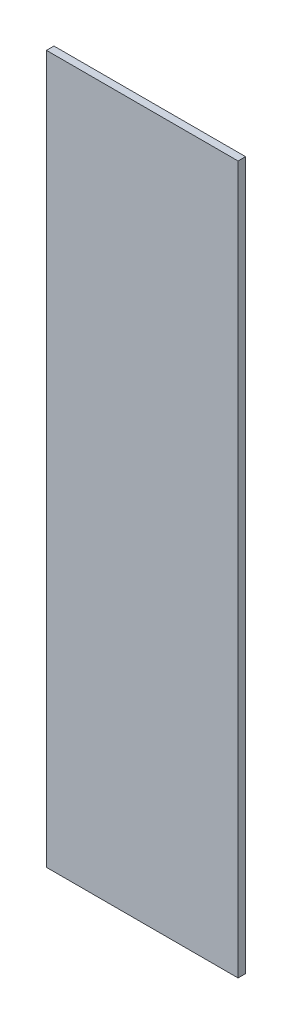
ISO-10303-21;
HEADER;
FILE_DESCRIPTION(('STEP AP214'),'2;1');
FILE_NAME('part.step','',(''),(''),'','','');
FILE_SCHEMA(('AUTOMOTIVE_DESIGN { 1 0 10303 214 1 1 1 1 }'));
ENDSEC;
DATA;
#1=APPLICATION_CONTEXT('core data for automotive mechanical design processes');
#2=APPLICATION_PROTOCOL_DEFINITION('international standard','automotive_design',2000,#1);
#3=PRODUCT_CONTEXT('',#1,'mechanical');
#4=PRODUCT('Part','Part','',(#3));
#5=PRODUCT_RELATED_PRODUCT_CATEGORY('part','',(#4));
#6=PRODUCT_DEFINITION_FORMATION('','',#4);
#7=PRODUCT_DEFINITION_CONTEXT('part definition',#1,'design');
#8=PRODUCT_DEFINITION('design','',#6,#7);
#9=PRODUCT_DEFINITION_SHAPE('','',#8);
#10=(LENGTH_UNIT() NAMED_UNIT(*) SI_UNIT(.MILLI.,.METRE.));
#11=(NAMED_UNIT(*) PLANE_ANGLE_UNIT() SI_UNIT($,.RADIAN.));
#12=(NAMED_UNIT(*) SI_UNIT($,.STERADIAN.) SOLID_ANGLE_UNIT());
#13=UNCERTAINTY_MEASURE_WITH_UNIT(LENGTH_MEASURE(1.E-05),#10,'distance_accuracy_value','');
#14=(GEOMETRIC_REPRESENTATION_CONTEXT(3) GLOBAL_UNCERTAINTY_ASSIGNED_CONTEXT((#13)) GLOBAL_UNIT_ASSIGNED_CONTEXT((#10,
#11,#12)) REPRESENTATION_CONTEXT('',''));
#15=CARTESIAN_POINT('',(0.,0.,0.));
#16=DIRECTION('',(0.,0.,1.));
#17=DIRECTION('',(1.,0.,0.));
#18=AXIS2_PLACEMENT_3D('',#15,#16,#17);
#19=CARTESIAN_POINT('',(325.,1200.,-12.7));
#20=DIRECTION('',(1.,0.,0.));
#21=DIRECTION('',(0.,1.,0.));
#22=AXIS2_PLACEMENT_3D('',#19,#20,#21);
#23=PLANE('',#22);
#24=DIRECTION('',(0.,0.,1.));
#25=VECTOR('',#24,1.);
#26=CARTESIAN_POINT('',(325.,1200.,-12.7));
#27=LINE('',#26,#25);
#28=CARTESIAN_POINT('',(325.,1200.,-12.7));
#29=VERTEX_POINT('',#28);
#30=CARTESIAN_POINT('',(325.,1200.,12.7));
#31=VERTEX_POINT('',#30);
#32=EDGE_CURVE('E42',#29,#31,#27,.T.);
#33=ORIENTED_EDGE('',*,*,#32,.T.);
#34=DIRECTION('',(0.,1.,0.));
#35=VECTOR('',#34,1.);
#36=CARTESIAN_POINT('',(325.,1200.,12.7));
#37=LINE('',#36,#35);
#38=CARTESIAN_POINT('',(325.,-1200.,12.7));
#39=VERTEX_POINT('',#38);
#40=EDGE_CURVE('E79',#39,#31,#37,.T.);
#41=ORIENTED_EDGE('',*,*,#40,.F.);
#42=DIRECTION('',(0.,0.,1.));
#43=VECTOR('',#42,1.);
#44=CARTESIAN_POINT('',(325.,-1200.,-12.7));
#45=LINE('',#44,#43);
#46=CARTESIAN_POINT('',(325.,-1200.,-12.7));
#47=VERTEX_POINT('',#46);
#48=EDGE_CURVE('E11',#47,#39,#45,.T.);
#49=ORIENTED_EDGE('',*,*,#48,.F.);
#50=DIRECTION('',(0.,1.,0.));
#51=VECTOR('',#50,1.);
#52=CARTESIAN_POINT('',(325.,1200.,-12.7));
#53=LINE('',#52,#51);
#54=EDGE_CURVE('E80',#47,#29,#53,.T.);
#55=ORIENTED_EDGE('',*,*,#54,.T.);
#56=EDGE_LOOP('',(#33,#41,#49,#55));
#57=FACE_BOUND('',#56,.T.);
#58=ADVANCED_FACE('F39',(#57),#23,.T.);
#59=CARTESIAN_POINT('',(-325.,-1200.,-12.7));
#60=DIRECTION('',(0.,-1.,0.));
#61=DIRECTION('',(0.,0.,-1.));
#62=AXIS2_PLACEMENT_3D('',#59,#60,#61);
#63=PLANE('',#62);
#64=ORIENTED_EDGE('',*,*,#48,.T.);
#65=DIRECTION('',(1.,0.,0.));
#66=VECTOR('',#65,1.);
#67=CARTESIAN_POINT('',(-325.,-1200.,12.7));
#68=LINE('',#67,#66);
#69=CARTESIAN_POINT('',(-325.,-1200.,12.7));
#70=VERTEX_POINT('',#69);
#71=EDGE_CURVE('E96',#70,#39,#68,.T.);
#72=ORIENTED_EDGE('',*,*,#71,.F.);
#73=DIRECTION('',(0.,0.,1.));
#74=VECTOR('',#73,1.);
#75=CARTESIAN_POINT('',(-325.,-1200.,-12.7));
#76=LINE('',#75,#74);
#77=CARTESIAN_POINT('',(-325.,-1200.,-12.7));
#78=VERTEX_POINT('',#77);
#79=EDGE_CURVE('E47',#78,#70,#76,.T.);
#80=ORIENTED_EDGE('',*,*,#79,.F.);
#81=DIRECTION('',(1.,0.,0.));
#82=VECTOR('',#81,1.);
#83=CARTESIAN_POINT('',(-325.,-1200.,-12.7));
#84=LINE('',#83,#82);
#85=EDGE_CURVE('E85',#78,#47,#84,.T.);
#86=ORIENTED_EDGE('',*,*,#85,.T.);
#87=EDGE_LOOP('',(#64,#72,#80,#86));
#88=FACE_BOUND('',#87,.T.);
#89=ADVANCED_FACE('F111',(#88),#63,.T.);
#90=CARTESIAN_POINT('',(-325.,1200.,-12.7));
#91=DIRECTION('',(-1.,0.,0.));
#92=DIRECTION('',(0.,-1.,0.));
#93=AXIS2_PLACEMENT_3D('',#90,#91,#92);
#94=PLANE('',#93);
#95=ORIENTED_EDGE('',*,*,#79,.T.);
#96=DIRECTION('',(0.,-1.,0.));
#97=VECTOR('',#96,1.);
#98=CARTESIAN_POINT('',(-325.,1200.,12.7));
#99=LINE('',#98,#97);
#100=CARTESIAN_POINT('',(-325.,1200.,12.7));
#101=VERTEX_POINT('',#100);
#102=EDGE_CURVE('E92',#101,#70,#99,.T.);
#103=ORIENTED_EDGE('',*,*,#102,.F.);
#104=DIRECTION('',(0.,0.,1.));
#105=VECTOR('',#104,1.);
#106=CARTESIAN_POINT('',(-325.,1200.,-12.7));
#107=LINE('',#106,#105);
#108=CARTESIAN_POINT('',(-325.,1200.,-12.7));
#109=VERTEX_POINT('',#108);
#110=EDGE_CURVE('E84',#109,#101,#107,.T.);
#111=ORIENTED_EDGE('',*,*,#110,.F.);
#112=DIRECTION('',(0.,-1.,0.));
#113=VECTOR('',#112,1.);
#114=CARTESIAN_POINT('',(-325.,1200.,-12.7));
#115=LINE('',#114,#113);
#116=EDGE_CURVE('E104',#109,#78,#115,.T.);
#117=ORIENTED_EDGE('',*,*,#116,.T.);
#118=EDGE_LOOP('',(#95,#103,#111,#117));
#119=FACE_BOUND('',#118,.T.);
#120=ADVANCED_FACE('F108',(#119),#94,.T.);
#121=CARTESIAN_POINT('',(-325.,1200.,-12.7));
#122=DIRECTION('',(0.,1.,0.));
#123=DIRECTION('',(0.,0.,1.));
#124=AXIS2_PLACEMENT_3D('',#121,#122,#123);
#125=PLANE('',#124);
#126=ORIENTED_EDGE('',*,*,#110,.T.);
#127=DIRECTION('',(-1.,0.,0.));
#128=VECTOR('',#127,1.);
#129=CARTESIAN_POINT('',(-325.,1200.,12.7));
#130=LINE('',#129,#128);
#131=EDGE_CURVE('E87',#31,#101,#130,.T.);
#132=ORIENTED_EDGE('',*,*,#131,.F.);
#133=ORIENTED_EDGE('',*,*,#32,.F.);
#134=DIRECTION('',(-1.,0.,0.));
#135=VECTOR('',#134,1.);
#136=CARTESIAN_POINT('',(-325.,1200.,-12.7));
#137=LINE('',#136,#135);
#138=EDGE_CURVE('E102',#29,#109,#137,.T.);
#139=ORIENTED_EDGE('',*,*,#138,.T.);
#140=EDGE_LOOP('',(#126,#132,#133,#139));
#141=FACE_BOUND('',#140,.T.);
#142=ADVANCED_FACE('F88',(#141),#125,.T.);
#143=CARTESIAN_POINT('',(0.,0.,-12.7));
#144=DIRECTION('',(0.,0.,1.));
#145=DIRECTION('',(1.,0.,0.));
#146=AXIS2_PLACEMENT_3D('',#143,#144,#145);
#147=PLANE('',#146);
#148=ORIENTED_EDGE('',*,*,#54,.F.);
#149=ORIENTED_EDGE('',*,*,#85,.F.);
#150=ORIENTED_EDGE('',*,*,#116,.F.);
#151=ORIENTED_EDGE('',*,*,#138,.F.);
#152=EDGE_LOOP('',(#148,#149,#150,#151));
#153=FACE_BOUND('',#152,.T.);
#154=ADVANCED_FACE('F113',(#153),#147,.F.);
#155=CARTESIAN_POINT('',(0.,0.,12.7));
#156=DIRECTION('',(0.,0.,1.));
#157=DIRECTION('',(1.,0.,0.));
#158=AXIS2_PLACEMENT_3D('',#155,#156,#157);
#159=PLANE('',#158);
#160=ORIENTED_EDGE('',*,*,#40,.T.);
#161=ORIENTED_EDGE('',*,*,#131,.T.);
#162=ORIENTED_EDGE('',*,*,#102,.T.);
#163=ORIENTED_EDGE('',*,*,#71,.T.);
#164=EDGE_LOOP('',(#160,#161,#162,#163));
#165=FACE_BOUND('',#164,.T.);
#166=ADVANCED_FACE('F95',(#165),#159,.T.);
#167=CLOSED_SHELL('',(#58,#89,#120,#142,#154,#166));
#168=MANIFOLD_SOLID_BREP('B2',#167);
#169=ADVANCED_BREP_SHAPE_REPRESENTATION('',(#18,#168),#14);
#170=SHAPE_DEFINITION_REPRESENTATION(#9,#169);
ENDSEC;
END-ISO-10303-21;
